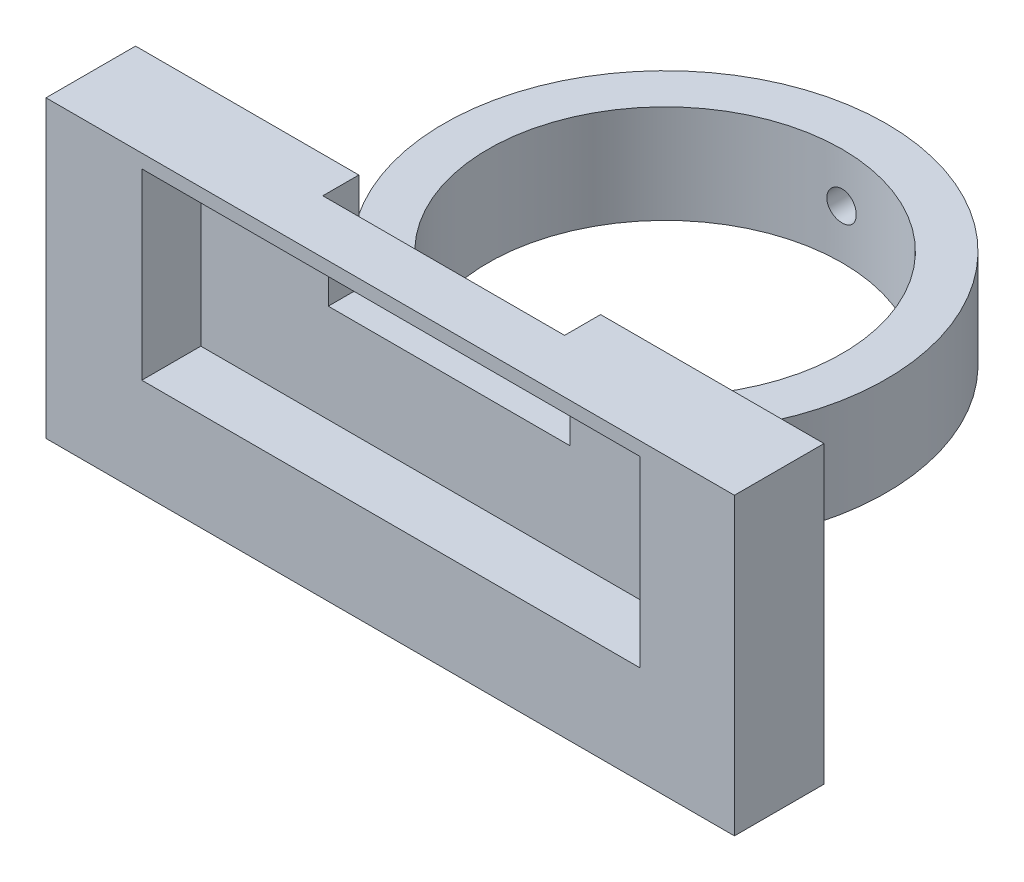
ISO-10303-21;
HEADER;
FILE_DESCRIPTION(('STEP AP214'),'2;1');
FILE_NAME('part.step','',(''),(''),'','','');
FILE_SCHEMA(('AUTOMOTIVE_DESIGN { 1 0 10303 214 1 1 1 1 }'));
ENDSEC;
DATA;
#1=APPLICATION_CONTEXT('core data for automotive mechanical design processes');
#2=APPLICATION_PROTOCOL_DEFINITION('international standard','automotive_design',2000,#1);
#3=PRODUCT_CONTEXT('',#1,'mechanical');
#4=PRODUCT('Part','Part','',(#3));
#5=PRODUCT_RELATED_PRODUCT_CATEGORY('part','',(#4));
#6=PRODUCT_DEFINITION_FORMATION('','',#4);
#7=PRODUCT_DEFINITION_CONTEXT('part definition',#1,'design');
#8=PRODUCT_DEFINITION('design','',#6,#7);
#9=PRODUCT_DEFINITION_SHAPE('','',#8);
#10=(LENGTH_UNIT() NAMED_UNIT(*) SI_UNIT(.MILLI.,.METRE.));
#11=(NAMED_UNIT(*) PLANE_ANGLE_UNIT() SI_UNIT($,.RADIAN.));
#12=(NAMED_UNIT(*) SI_UNIT($,.STERADIAN.) SOLID_ANGLE_UNIT());
#13=UNCERTAINTY_MEASURE_WITH_UNIT(LENGTH_MEASURE(1.E-05),#10,'distance_accuracy_value','');
#14=(GEOMETRIC_REPRESENTATION_CONTEXT(3) GLOBAL_UNCERTAINTY_ASSIGNED_CONTEXT((#13)) GLOBAL_UNIT_ASSIGNED_CONTEXT((#10,
#11,#12)) REPRESENTATION_CONTEXT('',''));
#15=CARTESIAN_POINT('',(0.,0.,0.));
#16=DIRECTION('',(0.,0.,1.));
#17=DIRECTION('',(1.,0.,0.));
#18=AXIS2_PLACEMENT_3D('',#15,#16,#17);
#19=CARTESIAN_POINT('',(-25.2569744084497,0.,27.9510252377639));
#20=DIRECTION('',(-1.,0.,0.));
#21=DIRECTION('',(0.,0.,1.));
#22=AXIS2_PLACEMENT_3D('',#19,#20,#21);
#23=PLANE('',#22);
#24=DIRECTION('',(0.,0.,-1.));
#25=VECTOR('',#24,1.);
#26=CARTESIAN_POINT('',(-25.2569744084497,18.613856740096,27.9510252377639));
#27=LINE('',#26,#25);
#28=CARTESIAN_POINT('',(-25.2569744084497,18.613856740096,27.9510252377639));
#29=VERTEX_POINT('',#28);
#30=CARTESIAN_POINT('',(-25.2569744084497,18.613856740096,21.9510252377639));
#31=VERTEX_POINT('',#30);
#32=EDGE_CURVE('E68',#29,#31,#27,.T.);
#33=ORIENTED_EDGE('',*,*,#32,.F.);
#34=DIRECTION('',(0.,1.,0.));
#35=VECTOR('',#34,1.);
#36=CARTESIAN_POINT('',(-25.2569744084497,0.,27.9510252377639));
#37=LINE('',#36,#35);
#38=CARTESIAN_POINT('',(-25.2569744084497,0.,27.9510252377639));
#39=VERTEX_POINT('',#38);
#40=EDGE_CURVE('E263',#39,#29,#37,.T.);
#41=ORIENTED_EDGE('',*,*,#40,.F.);
#42=DIRECTION('',(0.,0.,1.));
#43=VECTOR('',#42,1.);
#44=CARTESIAN_POINT('',(-25.2569744084497,0.,27.9510252377639));
#45=LINE('',#44,#43);
#46=CARTESIAN_POINT('',(-25.2569744084497,0.,21.9510252377639));
#47=VERTEX_POINT('',#46);
#48=EDGE_CURVE('E242',#47,#39,#45,.T.);
#49=ORIENTED_EDGE('',*,*,#48,.F.);
#50=DIRECTION('',(0.,1.,0.));
#51=VECTOR('',#50,1.);
#52=CARTESIAN_POINT('',(-25.2569744084497,0.,21.9510252377639));
#53=LINE('',#52,#51);
#54=EDGE_CURVE('E264',#47,#31,#53,.T.);
#55=ORIENTED_EDGE('',*,*,#54,.T.);
#56=EDGE_LOOP('',(#33,#41,#49,#55));
#57=FACE_BOUND('',#56,.T.);
#58=ADVANCED_FACE('F43',(#57),#23,.F.);
#59=CARTESIAN_POINT('',(-25.2569744084497,0.,21.9510252377639));
#60=DIRECTION('',(0.,0.,-1.));
#61=DIRECTION('',(-1.,0.,0.));
#62=AXIS2_PLACEMENT_3D('',#59,#60,#61);
#63=PLANE('',#62);
#64=DIRECTION('',(0.,1.,0.));
#65=VECTOR('',#64,1.);
#66=CARTESIAN_POINT('',(-12.2980825177343,0.,21.9510252377639));
#67=LINE('',#66,#65);
#68=CARTESIAN_POINT('',(-12.2980825177343,10.,21.9510252377639));
#69=VERTEX_POINT('',#68);
#70=CARTESIAN_POINT('',(-12.2980825177343,18.613856740096,21.9510252377639));
#71=VERTEX_POINT('',#70);
#72=EDGE_CURVE('E446',#69,#71,#67,.T.);
#73=ORIENTED_EDGE('',*,*,#72,.T.);
#74=DIRECTION('',(1.,0.,0.));
#75=VECTOR('',#74,1.);
#76=CARTESIAN_POINT('',(-30.6266619174264,18.613856740096,21.9510252377639));
#77=LINE('',#76,#75);
#78=EDGE_CURVE('E218',#31,#71,#77,.T.);
#79=ORIENTED_EDGE('',*,*,#78,.F.);
#80=ORIENTED_EDGE('',*,*,#54,.F.);
#81=DIRECTION('',(-1.,0.,0.));
#82=VECTOR('',#81,1.);
#83=CARTESIAN_POINT('',(-25.2569744084497,0.,21.9510252377639));
#84=LINE('',#83,#82);
#85=CARTESIAN_POINT('',(25.3733380825736,0.,21.9510252377639));
#86=VERTEX_POINT('',#85);
#87=EDGE_CURVE('E259',#86,#47,#84,.T.);
#88=ORIENTED_EDGE('',*,*,#87,.F.);
#89=DIRECTION('',(0.,1.,0.));
#90=VECTOR('',#89,1.);
#91=CARTESIAN_POINT('',(25.3733380825736,0.,21.9510252377639));
#92=LINE('',#91,#90);
#93=CARTESIAN_POINT('',(25.3733380825736,18.613856740096,21.9510252377639));
#94=VERTEX_POINT('',#93);
#95=EDGE_CURVE('E268',#86,#94,#92,.T.);
#96=ORIENTED_EDGE('',*,*,#95,.T.);
#97=CARTESIAN_POINT('',(12.2856792543905,18.613856740096,21.9510252377639));
#98=VERTEX_POINT('',#97);
#99=EDGE_CURVE('E217',#98,#94,#77,.T.);
#100=ORIENTED_EDGE('',*,*,#99,.F.);
#101=DIRECTION('',(0.,-1.,0.));
#102=VECTOR('',#101,1.);
#103=CARTESIAN_POINT('',(12.2856792543905,0.,21.9510252377639));
#104=LINE('',#103,#102);
#105=CARTESIAN_POINT('',(12.2856792543905,18.2212870740273,21.9510252377639));
#106=VERTEX_POINT('',#105);
#107=EDGE_CURVE('E199',#98,#106,#104,.T.);
#108=ORIENTED_EDGE('',*,*,#107,.T.);
#109=DIRECTION('',(1.,0.,0.));
#110=VECTOR('',#109,1.);
#111=CARTESIAN_POINT('',(-25.2569744084497,18.2212870740273,21.9510252377639));
#112=LINE('',#111,#110);
#113=CARTESIAN_POINT('',(12.293576837323,18.2212870740273,21.9510252377639));
#114=VERTEX_POINT('',#113);
#115=EDGE_CURVE('E448',#106,#114,#112,.T.);
#116=ORIENTED_EDGE('',*,*,#115,.T.);
#117=DIRECTION('',(0.,-1.,0.));
#118=VECTOR('',#117,1.);
#119=CARTESIAN_POINT('',(12.293576837323,0.,21.9510252377639));
#120=LINE('',#119,#118);
#121=CARTESIAN_POINT('',(12.293576837323,10.,21.9510252377639));
#122=VERTEX_POINT('',#121);
#123=EDGE_CURVE('E450',#114,#122,#120,.T.);
#124=ORIENTED_EDGE('',*,*,#123,.T.);
#125=DIRECTION('',(-1.,0.,0.));
#126=VECTOR('',#125,1.);
#127=CARTESIAN_POINT('',(-25.2569744084497,10.,21.9510252377639));
#128=LINE('',#127,#126);
#129=EDGE_CURVE('E308',#122,#69,#128,.T.);
#130=ORIENTED_EDGE('',*,*,#129,.T.);
#131=EDGE_LOOP('',(#73,#79,#80,#88,#96,#100,#108,#116,#124,#130));
#132=FACE_BOUND('',#131,.T.);
#133=ADVANCED_FACE('F333',(#132),#63,.F.);
#134=CARTESIAN_POINT('',(25.3733380825736,0.,27.9510252377639));
#135=DIRECTION('',(1.,0.,0.));
#136=DIRECTION('',(0.,0.,-1.));
#137=AXIS2_PLACEMENT_3D('',#134,#135,#136);
#138=PLANE('',#137);
#139=DIRECTION('',(0.,0.,1.));
#140=VECTOR('',#139,1.);
#141=CARTESIAN_POINT('',(25.3733380825736,18.613856740096,21.951025237764));
#142=LINE('',#141,#140);
#143=CARTESIAN_POINT('',(25.3733380825736,18.613856740096,27.9510252377639));
#144=VERTEX_POINT('',#143);
#145=EDGE_CURVE('E209',#94,#144,#142,.T.);
#146=ORIENTED_EDGE('',*,*,#145,.F.);
#147=ORIENTED_EDGE('',*,*,#95,.F.);
#148=DIRECTION('',(0.,0.,-1.));
#149=VECTOR('',#148,1.);
#150=CARTESIAN_POINT('',(25.3733380825736,0.,27.9510252377639));
#151=LINE('',#150,#149);
#152=CARTESIAN_POINT('',(25.3733380825736,0.,27.9510252377639));
#153=VERTEX_POINT('',#152);
#154=EDGE_CURVE('E255',#153,#86,#151,.T.);
#155=ORIENTED_EDGE('',*,*,#154,.F.);
#156=DIRECTION('',(0.,1.,0.));
#157=VECTOR('',#156,1.);
#158=CARTESIAN_POINT('',(25.3733380825736,0.,27.9510252377639));
#159=LINE('',#158,#157);
#160=EDGE_CURVE('E272',#153,#144,#159,.T.);
#161=ORIENTED_EDGE('',*,*,#160,.T.);
#162=EDGE_LOOP('',(#146,#147,#155,#161));
#163=FACE_BOUND('',#162,.T.);
#164=ADVANCED_FACE('F322',(#163),#138,.F.);
#165=CARTESIAN_POINT('',(0.,10.,0.));
#166=DIRECTION('',(0.,1.,0.));
#167=DIRECTION('',(0.,0.,1.));
#168=AXIS2_PLACEMENT_3D('',#165,#166,#167);
#169=PLANE('',#168);
#170=CARTESIAN_POINT('',(0.,10.,0.));
#171=DIRECTION('',(0.,1.,0.));
#172=DIRECTION('',(0.,0.,1.));
#173=AXIS2_PLACEMENT_3D('',#170,#171,#172);
#174=CIRCLE('',#173,22.5);
#175=CARTESIAN_POINT('',(12.293576837323,10.,18.8445739815162));
#176=VERTEX_POINT('',#175);
#177=CARTESIAN_POINT('',(-12.293576837323,10.,18.8445739815162));
#178=VERTEX_POINT('',#177);
#179=EDGE_CURVE('E434',#176,#178,#174,.T.);
#180=ORIENTED_EDGE('',*,*,#179,.T.);
#181=DIRECTION('',(-1.,0.,0.));
#182=VECTOR('',#181,1.);
#183=CARTESIAN_POINT('',(12.293576837323,10.,18.8445739815162));
#184=LINE('',#183,#182);
#185=CARTESIAN_POINT('',(-12.2980825177343,10.,18.8445739815162));
#186=VERTEX_POINT('',#185);
#187=EDGE_CURVE('E228',#178,#186,#184,.T.);
#188=ORIENTED_EDGE('',*,*,#187,.T.);
#189=DIRECTION('',(0.,0.,-1.));
#190=VECTOR('',#189,1.);
#191=CARTESIAN_POINT('',(-12.2980825177343,10.,34.8445739815162));
#192=LINE('',#191,#190);
#193=EDGE_CURVE('E243',#69,#186,#192,.T.);
#194=ORIENTED_EDGE('',*,*,#193,.F.);
#195=ORIENTED_EDGE('',*,*,#129,.F.);
#196=DIRECTION('',(0.,0.,-1.));
#197=VECTOR('',#196,1.);
#198=CARTESIAN_POINT('',(12.293576837323,10.,34.8445739815162));
#199=LINE('',#198,#197);
#200=EDGE_CURVE('E237',#122,#176,#199,.T.);
#201=ORIENTED_EDGE('',*,*,#200,.T.);
#202=EDGE_LOOP('',(#180,#188,#194,#195,#201));
#203=FACE_BOUND('',#202,.T.);
#204=CARTESIAN_POINT('',(0.,10.,0.));
#205=DIRECTION('',(0.,1.,0.));
#206=DIRECTION('',(0.,0.,1.));
#207=AXIS2_PLACEMENT_3D('',#204,#205,#206);
#208=CIRCLE('',#207,18.);
#209=CARTESIAN_POINT('',(0.,10.,18.));
#210=VERTEX_POINT('',#209);
#211=EDGE_CURVE('E426',#210,#210,#208,.T.);
#212=ORIENTED_EDGE('',*,*,#211,.F.);
#213=EDGE_LOOP('',(#212));
#214=FACE_BOUND('',#213,.T.);
#215=ADVANCED_FACE('F319',(#203,#214),#169,.T.);
#216=CARTESIAN_POINT('',(0.,0.,0.));
#217=DIRECTION('',(0.,1.,0.));
#218=DIRECTION('',(0.,0.,1.));
#219=AXIS2_PLACEMENT_3D('',#216,#217,#218);
#220=PLANE('',#219);
#221=CARTESIAN_POINT('',(0.,0.,0.));
#222=DIRECTION('',(0.,1.,0.));
#223=DIRECTION('',(0.,0.,1.));
#224=AXIS2_PLACEMENT_3D('',#221,#222,#223);
#225=CIRCLE('',#224,22.5);
#226=CARTESIAN_POINT('',(12.293576837323,0.,18.8445739815162));
#227=VERTEX_POINT('',#226);
#228=CARTESIAN_POINT('',(-12.293576837323,0.,18.8445739815162));
#229=VERTEX_POINT('',#228);
#230=EDGE_CURVE('E430',#227,#229,#225,.T.);
#231=ORIENTED_EDGE('',*,*,#230,.F.);
#232=DIRECTION('',(-1.,0.,0.));
#233=VECTOR('',#232,1.);
#234=CARTESIAN_POINT('',(0.,0.,18.8445739815162));
#235=LINE('',#234,#233);
#236=EDGE_CURVE('E418',#227,#229,#235,.T.);
#237=ORIENTED_EDGE('',*,*,#236,.T.);
#238=EDGE_LOOP('',(#231,#237));
#239=FACE_BOUND('',#238,.T.);
#240=CARTESIAN_POINT('',(0.,0.,0.));
#241=DIRECTION('',(0.,1.,0.));
#242=DIRECTION('',(0.,0.,1.));
#243=AXIS2_PLACEMENT_3D('',#240,#241,#242);
#244=CIRCLE('',#243,18.);
#245=CARTESIAN_POINT('',(0.,0.,18.));
#246=VERTEX_POINT('',#245);
#247=EDGE_CURVE('E422',#246,#246,#244,.T.);
#248=ORIENTED_EDGE('',*,*,#247,.T.);
#249=EDGE_LOOP('',(#248));
#250=FACE_BOUND('',#249,.T.);
#251=ADVANCED_FACE('F321',(#239,#250),#220,.F.);
#252=CARTESIAN_POINT('',(0.,10.,0.));
#253=DIRECTION('',(0.,-1.,0.));
#254=DIRECTION('',(0.,0.,-1.));
#255=AXIS2_PLACEMENT_3D('',#252,#253,#254);
#256=CYLINDRICAL_SURFACE('',#255,22.5);
#257=CARTESIAN_POINT('',(0.,3.5,-22.5));
#258=CARTESIAN_POINT('',(0.0841553862061873,3.50000369832235,-22.4999993369769));
#259=CARTESIAN_POINT('',(0.168369408071617,3.50710593144399,-22.4995228116078));
#260=CARTESIAN_POINT('',(0.334471280191391,3.53533573960185,-22.497667670565));
#261=CARTESIAN_POINT('',(0.41635632102312,3.55647956195042,-22.4962880099136));
#262=CARTESIAN_POINT('',(0.575370251039544,3.61218181268163,-22.4927826451578));
#263=CARTESIAN_POINT('',(0.652501656048259,3.64673307339375,-22.4906573397362));
#264=CARTESIAN_POINT('',(0.799850197924485,3.72825757575682,-22.4858995992832));
#265=CARTESIAN_POINT('',(0.870068894772799,3.77522800593263,-22.4832672790674));
#266=CARTESIAN_POINT('',(1.00173689918826,3.88034390087404,-22.4777863462909));
#267=CARTESIAN_POINT('',(1.06317301001788,3.93850588076531,-22.4749374178917));
#268=CARTESIAN_POINT('',(1.17541895156628,4.06431960769198,-22.4693470467491));
#269=CARTESIAN_POINT('',(1.22622833433915,4.13197175456335,-22.4666056085405));
#270=CARTESIAN_POINT('',(1.31582019049005,4.27492143699416,-22.4615369005082));
#271=CARTESIAN_POINT('',(1.35459154398957,4.35022595656899,-22.4592100144587));
#272=CARTESIAN_POINT('',(1.4189356460874,4.50629386174517,-22.4552369590289));
#273=CARTESIAN_POINT('',(1.44450855269208,4.58705718198292,-22.4535907814995));
#274=CARTESIAN_POINT('',(1.48169279908933,4.75162166691468,-22.4511678264529));
#275=CARTESIAN_POINT('',(1.49332502464134,4.83541809290052,-22.4503897484806));
#276=CARTESIAN_POINT('',(1.50236219626205,5.00377744658921,-22.4497868445664));
#277=CARTESIAN_POINT('',(1.49976732218638,5.08834036458875,-22.4499620065739));
#278=CARTESIAN_POINT('',(1.48044127015912,5.25568981402293,-22.4512446225728));
#279=CARTESIAN_POINT('',(1.46373271011688,5.33847897046898,-22.4523505848985));
#280=CARTESIAN_POINT('',(1.41668867338703,5.50007493564271,-22.4553678236737));
#281=CARTESIAN_POINT('',(1.38635310588313,5.57888171782623,-22.4572791054904));
#282=CARTESIAN_POINT('',(1.31289055516614,5.7303484616906,-22.4616933187345));
#283=CARTESIAN_POINT('',(1.26975333176157,5.80300344244616,-22.4641967234813));
#284=CARTESIAN_POINT('',(1.17191938938483,5.94004971876683,-22.4695126084811));
#285=CARTESIAN_POINT('',(1.11722252197117,6.0044409081966,-22.4723250927028));
#286=CARTESIAN_POINT('',(0.997694641249183,6.12326335209135,-22.4779488260716));
#287=CARTESIAN_POINT('',(0.932844057297467,6.17767492229296,-22.4807600620948));
#288=CARTESIAN_POINT('',(0.794918162485277,6.27484168557975,-22.4860592351969));
#289=CARTESIAN_POINT('',(0.721842848365169,6.31759687404525,-22.4885471721478));
#290=CARTESIAN_POINT('',(0.569529742100743,6.39023562310141,-22.492919642884));
#291=CARTESIAN_POINT('',(0.490291582636195,6.42011841577157,-22.4948041406687));
#292=CARTESIAN_POINT('',(0.327907494120451,6.46615084935259,-22.497756914152));
#293=CARTESIAN_POINT('',(0.244761616997557,6.48230067270169,-22.4988252006937));
#294=CARTESIAN_POINT('',(0.077093056686902,6.50038429138487,-22.5000237801539));
#295=CARTESIAN_POINT('',(-0.00742667947026603,6.50234529737109,-22.5001558684598));
#296=CARTESIAN_POINT('',(-0.175593857513399,6.4920667455921,-22.4994719464797));
#297=CARTESIAN_POINT('',(-0.259241304570734,6.47982727206283,-22.4986559418176));
#298=CARTESIAN_POINT('',(-0.423212640794056,6.44151772946781,-22.4961688340459));
#299=CARTESIAN_POINT('',(-0.503539464763436,6.41546016743359,-22.4944985042516));
#300=CARTESIAN_POINT('',(-0.658680012021291,6.35026684147132,-22.4904906131137));
#301=CARTESIAN_POINT('',(-0.733493678959281,6.31113094389102,-22.4881530449513));
#302=CARTESIAN_POINT('',(-0.875608697074926,6.22082276020867,-22.4830687483039));
#303=CARTESIAN_POINT('',(-0.942898494020247,6.16963232670972,-22.4803214052355));
#304=CARTESIAN_POINT('',(-1.06793929146973,6.05669455864405,-22.4747287160257));
#305=CARTESIAN_POINT('',(-1.12569018543068,5.99494710617811,-22.4718833687901));
#306=CARTESIAN_POINT('',(-1.23010622322674,5.8625305648099,-22.4664101381297));
#307=CARTESIAN_POINT('',(-1.27675369553493,5.79184752467411,-22.4637826056395));
#308=CARTESIAN_POINT('',(-1.35751781116107,5.6436362366452,-22.4590469316588));
#309=CARTESIAN_POINT('',(-1.39163454035583,5.56610803566846,-22.4569387866089));
#310=CARTESIAN_POINT('',(-1.44633820759184,5.40647136305112,-22.4534821719349));
#311=CARTESIAN_POINT('',(-1.46693621387226,5.32436669822714,-22.4521330809768));
#312=CARTESIAN_POINT('',(-1.49405386230003,5.15785500266751,-22.4503449996448));
#313=CARTESIAN_POINT('',(-1.5005736671706,5.07344799855492,-22.4499059987518));
#314=CARTESIAN_POINT('',(-1.49934822530218,4.90490331554578,-22.4499878612593));
#315=CARTESIAN_POINT('',(-1.49163075695864,4.82076543236533,-22.4505068555132));
#316=CARTESIAN_POINT('',(-1.46220749139271,4.65498309879855,-22.4524422638095));
#317=CARTESIAN_POINT('',(-1.44050166942031,4.57333865282421,-22.4538586794398));
#318=CARTESIAN_POINT('',(-1.38372425667426,4.41485705860405,-22.4574288540805));
#319=CARTESIAN_POINT('',(-1.34865285700377,4.33801984164201,-22.4595826025483));
#320=CARTESIAN_POINT('',(-1.26614347106291,4.19132038712225,-22.4643847219733));
#321=CARTESIAN_POINT('',(-1.21870578261043,4.12145798164587,-22.4670330810183));
#322=CARTESIAN_POINT('',(-1.11270716241545,3.99055004150066,-22.4725320443832));
#323=CARTESIAN_POINT('',(-1.0541260118745,3.92952089400215,-22.475383010332));
#324=CARTESIAN_POINT('',(-0.927533139832063,3.81814098609918,-22.4809627820297));
#325=CARTESIAN_POINT('',(-0.859519119169958,3.76779283666436,-22.4836915577811));
#326=CARTESIAN_POINT('',(-0.715904398258339,3.67916177368124,-22.4887226618343));
#327=CARTESIAN_POINT('',(-0.64029361195577,3.64089518720922,-22.4910244113345));
#328=CARTESIAN_POINT('',(-0.483759323129031,3.57764745615254,-22.4949345654383));
#329=CARTESIAN_POINT('',(-0.402842147075172,3.55265080294463,-22.4965437789929));
#330=CARTESIAN_POINT('',(-0.26786081065817,3.5231262656177,-22.4984673566654));
#331=CARTESIAN_POINT('',(-0.214668426242967,3.51446518502375,-22.499039532685));
#332=CARTESIAN_POINT('',(-0.107658694229485,3.50290087374109,-22.4998060661471));
#333=CARTESIAN_POINT('',(-0.0538413476281087,3.4999976338691,-22.5000004241922));
#334=CARTESIAN_POINT('',(0.,3.5,-22.5));
#335=B_SPLINE_CURVE_WITH_KNOTS('',3,(#257,#258,#259,#260,#261,#262,#263,#264,#265,#266,#267,
#268,#269,#270,#271,#272,#273,#274,#275,#276,#277,#278,#279,#280,#281,#282,#283,#284,#285,#286,
#287,#288,#289,#290,#291,#292,#293,#294,#295,#296,#297,#298,#299,#300,#301,#302,#303,#304,#305,
#306,#307,#308,#309,#310,#311,#312,#313,#314,#315,#316,#317,#318,#319,#320,#321,#322,#323,#324,
#325,#326,#327,#328,#329,#330,#331,#332,#333,#334),.UNSPECIFIED.,.T.,.F.,(4,2,2,2,2,2,2,2,2,2,2,
2,2,2,2,2,2,2,2,2,2,2,2,2,2,2,2,2,2,2,2,2,2,2,2,2,2,2,4),(0.,0.252269601066437,
0.504831609276693,0.757258782424872,1.00962885948595,1.26237424993085,1.51513029214491,
1.76811912259748,2.02110492430171,2.27371123002587,2.52631434236839,2.7785134115222,
3.03071416146472,3.28311719596362,3.53552347185635,3.78842237361861,4.04132137561042,
4.29423546255211,4.54714618955611,4.79957176729445,5.05199584767475,5.30419184290475,
5.55639041549575,5.80897111323598,6.06155463194424,6.31453749873668,6.56751863173209,
6.82029238121014,7.07306320898149,7.32534137618489,7.577619989753,7.82989499633663,
8.0821639279311,8.33489502146674,8.58768782410228,8.84082080405423,9.09365729155731,
9.25505583730029,9.41645412562546),.UNSPECIFIED.);
#336=CARTESIAN_POINT('',(0.,3.5,-22.5));
#337=VERTEX_POINT('',#336);
#338=EDGE_CURVE('E277',#337,#337,#335,.T.);
#339=ORIENTED_EDGE('',*,*,#338,.T.);
#340=EDGE_LOOP('',(#339));
#341=FACE_BOUND('',#340,.T.);
#342=ORIENTED_EDGE('',*,*,#179,.F.);
#343=DIRECTION('',(0.,-1.,0.));
#344=VECTOR('',#343,1.);
#345=CARTESIAN_POINT('',(12.293576837323,10.,18.8445739815162));
#346=LINE('',#345,#344);
#347=EDGE_CURVE('E306',#176,#227,#346,.T.);
#348=ORIENTED_EDGE('',*,*,#347,.T.);
#349=ORIENTED_EDGE('',*,*,#230,.T.);
#350=DIRECTION('',(0.,-1.,0.));
#351=VECTOR('',#350,1.);
#352=CARTESIAN_POINT('',(-12.293576837323,10.,18.8445739815162));
#353=LINE('',#352,#351);
#354=EDGE_CURVE('E438',#229,#178,#353,.F.);
#355=ORIENTED_EDGE('',*,*,#354,.T.);
#356=EDGE_LOOP('',(#342,#348,#349,#355));
#357=FACE_BOUND('',#356,.T.);
#358=ADVANCED_FACE('F45',(#341,#357),#256,.T.);
#359=CARTESIAN_POINT('',(0.,10.,0.));
#360=DIRECTION('',(0.,-1.,0.));
#361=DIRECTION('',(0.,0.,-1.));
#362=AXIS2_PLACEMENT_3D('',#359,#360,#361);
#363=CYLINDRICAL_SURFACE('',#362,18.);
#364=CARTESIAN_POINT('',(0.,6.5,-18.));
#365=CARTESIAN_POINT('',(-0.0840991348818063,6.49999632676058,-17.9999991811727));
#366=CARTESIAN_POINT('',(-0.168255520770338,6.49290354528343,-17.9994043281509));
#367=CARTESIAN_POINT('',(-0.334239856050584,6.46471347221738,-17.9970885349237));
#368=CARTESIAN_POINT('',(-0.416065057837845,6.44360031454265,-17.9953663189754));
#369=CARTESIAN_POINT('',(-0.574959033771391,6.38798426928595,-17.9909904186916));
#370=CARTESIAN_POINT('',(-0.652030470636923,6.35348895783527,-17.9883372614773));
#371=CARTESIAN_POINT('',(-0.799270850124113,6.27210135219201,-17.9823970161707));
#372=CARTESIAN_POINT('',(-0.869441264828082,6.22521170978374,-17.9791100637204));
#373=CARTESIAN_POINT('',(-1.00108499994839,6.12023740009101,-17.9722616980007));
#374=CARTESIAN_POINT('',(-1.06253830862424,6.06212767409647,-17.9686996812986));
#375=CARTESIAN_POINT('',(-1.17483170030483,5.9364156562251,-17.9617077120475));
#376=CARTESIAN_POINT('',(-1.22567131705726,5.86881294754607,-17.9582777653056));
#377=CARTESIAN_POINT('',(-1.31536188358534,5.72591282435146,-17.9519317899186));
#378=CARTESIAN_POINT('',(-1.35419524942731,5.65060433689584,-17.9490165177014));
#379=CARTESIAN_POINT('',(-1.41865865066077,5.49450755666603,-17.9440368667241));
#380=CARTESIAN_POINT('',(-1.44428891926862,5.41371936071262,-17.9419724729345));
#381=CARTESIAN_POINT('',(-1.48156054472786,5.24915691217823,-17.9389333809948));
#382=CARTESIAN_POINT('',(-1.49323449808466,5.1653900900111,-17.9379561440433));
#383=CARTESIAN_POINT('',(-1.50236281202314,4.99708069408195,-17.9371939848221));
#384=CARTESIAN_POINT('',(-1.49981743946931,4.9125381349085,-17.9374090401759));
#385=CARTESIAN_POINT('',(-1.48060629632227,4.74530050173422,-17.9390048604246));
#386=CARTESIAN_POINT('',(-1.46397595205708,4.66260132638538,-17.9403827006678));
#387=CARTESIAN_POINT('',(-1.41712197807441,4.50117219891057,-17.9441442535405));
#388=CARTESIAN_POINT('',(-1.38689821559518,4.42244228555922,-17.946527975994));
#389=CARTESIAN_POINT('',(-1.31367568222805,4.27107364118285,-17.9520360706028));
#390=CARTESIAN_POINT('',(-1.27066101713579,4.19844263361874,-17.9551613632645));
#391=CARTESIAN_POINT('',(-1.17308916587002,4.06141799177029,-17.9617996029582));
#392=CARTESIAN_POINT('',(-1.11853174593381,3.99702452435418,-17.9653125578405));
#393=CARTESIAN_POINT('',(-0.999224373339545,3.87809687107765,-17.9723433061747));
#394=CARTESIAN_POINT('',(-0.934443794085863,3.82359340380612,-17.975861081626));
#395=CARTESIAN_POINT('',(-0.796635834557626,3.72623041491717,-17.9824948780475));
#396=CARTESIAN_POINT('',(-0.723608448773006,3.68337090107967,-17.9856108987493));
#397=CARTESIAN_POINT('',(-0.571359889901777,3.61051435599694,-17.9910906871446));
#398=CARTESIAN_POINT('',(-0.492138062713611,3.58051868528277,-17.9934543752616));
#399=CARTESIAN_POINT('',(-0.329758603529373,3.53426280132301,-17.997162261177));
#400=CARTESIAN_POINT('',(-0.246601053253283,3.51800230301711,-17.9985064801333));
#401=CARTESIAN_POINT('',(-0.0789769502463768,3.49971685393763,-18.0000212541458));
#402=CARTESIAN_POINT('',(0.00548494367279356,3.49764947283965,-18.00019530738));
#403=CARTESIAN_POINT('',(0.173554128754954,3.50769779094097,-17.9993594816805));
#404=CARTESIAN_POINT('',(0.257161427882119,3.51981335784419,-17.9983496137901));
#405=CARTESIAN_POINT('',(0.421027134337048,3.55784848791514,-17.9952617676198));
#406=CARTESIAN_POINT('',(0.501290137709582,3.58374838403872,-17.9931853112613));
#407=CARTESIAN_POINT('',(0.656331247623733,3.64859688167304,-17.9881975516853));
#408=CARTESIAN_POINT('',(0.731109267424698,3.68754568948775,-17.9852862352686));
#409=CARTESIAN_POINT('',(0.87325082745286,3.77749302382453,-17.9789463959045));
#410=CARTESIAN_POINT('',(0.940596525782203,3.82851965959224,-17.9755166732811));
#411=CARTESIAN_POINT('',(1.06578164226543,3.94113358557572,-17.9685293795955));
#412=CARTESIAN_POINT('',(1.12362089522157,4.0027210592739,-17.9649718063129));
#413=CARTESIAN_POINT('',(1.22829681818265,4.13489253829751,-17.9581194182373));
#414=CARTESIAN_POINT('',(1.27510579985046,4.2054985117961,-17.9548252781133));
#415=CARTESIAN_POINT('',(1.35620259425928,4.35359339429512,-17.9488822761648));
#416=CARTESIAN_POINT('',(1.39049053201494,4.43108223456491,-17.9462334078977));
#417=CARTESIAN_POINT('',(1.44552476616085,4.59064518580886,-17.9418846427341));
#418=CARTESIAN_POINT('',(1.46628801217393,4.6727134170715,-17.9401835584295));
#419=CARTESIAN_POINT('',(1.49373865486523,4.83918604981164,-17.9379189853628));
#420=CARTESIAN_POINT('',(1.5004263218524,4.92359040639439,-17.9373554747545));
#421=CARTESIAN_POINT('',(1.4995328443364,5.09206418903134,-17.9374301692529));
#422=CARTESIAN_POINT('',(1.49199520466609,5.17613385085466,-17.938064710396));
#423=CARTESIAN_POINT('',(1.46295579494254,5.34180880032628,-17.9404562262346));
#424=CARTESIAN_POINT('',(1.44145400359144,5.42341408421576,-17.9422132026419));
#425=CARTESIAN_POINT('',(1.38510766502559,5.58184664489993,-17.9466506569756));
#426=CARTESIAN_POINT('',(1.3502639010098,5.65867420184853,-17.9493310806928));
#427=CARTESIAN_POINT('',(1.26822758842088,5.8053962608605,-17.955313498126));
#428=CARTESIAN_POINT('',(1.22103523367184,5.87529087171999,-17.9586154820857));
#429=CARTESIAN_POINT('',(1.11547791318367,6.00638560851952,-17.9654809754802));
#430=CARTESIAN_POINT('',(1.05708074061219,6.06755976298602,-17.9690452200862));
#431=CARTESIAN_POINT('',(0.930829838388699,6.17926277780498,-17.9760269251452));
#432=CARTESIAN_POINT('',(0.862973823961638,6.22978905874402,-17.9794443498724));
#433=CARTESIAN_POINT('',(0.719600659544123,6.31882979062634,-17.9857535226341));
#434=CARTESIAN_POINT('',(0.644069484405808,6.35732170798449,-17.9886442803466));
#435=CARTESIAN_POINT('',(0.4876436279936,6.42102770457692,-17.9935627877445));
#436=CARTESIAN_POINT('',(0.406755233120477,6.44625704643216,-17.9955915289238));
#437=CARTESIAN_POINT('',(0.27115807214502,6.47629637375307,-17.9980366160078));
#438=CARTESIAN_POINT('',(0.217321341657707,6.48517341877623,-17.9987695331543));
#439=CARTESIAN_POINT('',(0.108997757251744,6.49702641451581,-17.9997514898795));
#440=CARTESIAN_POINT('',(0.0545109050595676,6.5000023808997,-18.0000005307429));
#441=CARTESIAN_POINT('',(0.,6.5,-18.));
#442=B_SPLINE_CURVE_WITH_KNOTS('',3,(#364,#365,#366,#367,#368,#369,#370,#371,#372,#373,#374,
#375,#376,#377,#378,#379,#380,#381,#382,#383,#384,#385,#386,#387,#388,#389,#390,#391,#392,#393,
#394,#395,#396,#397,#398,#399,#400,#401,#402,#403,#404,#405,#406,#407,#408,#409,#410,#411,#412,
#413,#414,#415,#416,#417,#418,#419,#420,#421,#422,#423,#424,#425,#426,#427,#428,#429,#430,#431,
#432,#433,#434,#435,#436,#437,#438,#439,#440,#441),.UNSPECIFIED.,.T.,.F.,(4,2,2,2,2,2,2,2,2,2,2,
2,2,2,2,2,2,2,2,2,2,2,2,2,2,2,2,2,2,2,2,2,2,2,2,2,2,2,4),(0.,0.252098380200208,
0.504482533496752,0.756724010833431,1.00891156437627,1.26166900317865,1.51443754310897,
1.76757454426637,2.02070707391851,2.27324722247379,2.52578263143928,2.77768474665434,
3.02958932215498,3.28180823623349,3.5340322587129,3.78702676402724,4.04002143837967,
4.29304286385675,4.54605903798802,4.79831848960753,5.05057558821332,5.30247373546178,
5.55437586542058,5.8068701246239,6.05936877106876,6.31249464736803,6.56561799629742,
6.81842350861392,7.07122416598136,7.32325294323791,7.5752821048851,7.82729647421284,
8.07930688814784,8.33205282996958,8.58485992848721,8.8381375959383,9.09112314887678,
9.25452729534993,9.41793100798119),.UNSPECIFIED.);
#443=CARTESIAN_POINT('',(0.,6.5,-18.));
#444=VERTEX_POINT('',#443);
#445=EDGE_CURVE('E267',#444,#444,#442,.T.);
#446=ORIENTED_EDGE('',*,*,#445,.F.);
#447=EDGE_LOOP('',(#446));
#448=FACE_BOUND('',#447,.T.);
#449=ORIENTED_EDGE('',*,*,#211,.T.);
#450=EDGE_LOOP('',(#449));
#451=FACE_BOUND('',#450,.T.);
#452=ORIENTED_EDGE('',*,*,#247,.F.);
#453=EDGE_LOOP('',(#452));
#454=FACE_BOUND('',#453,.T.);
#455=ADVANCED_FACE('F310',(#448,#451,#454),#363,.F.);
#456=CARTESIAN_POINT('',(-35.,-10.,18.8445739815162));
#457=DIRECTION('',(0.,0.,-1.));
#458=DIRECTION('',(-1.,0.,0.));
#459=AXIS2_PLACEMENT_3D('',#456,#457,#458);
#460=PLANE('',#459);
#461=DIRECTION('',(-1.,0.,0.));
#462=VECTOR('',#461,1.);
#463=CARTESIAN_POINT('',(-35.,20.,18.8445739815162));
#464=LINE('',#463,#462);
#465=CARTESIAN_POINT('',(-12.2980825177343,20.,18.8445739815162));
#466=VERTEX_POINT('',#465);
#467=CARTESIAN_POINT('',(-35.,20.,18.8445739815162));
#468=VERTEX_POINT('',#467);
#469=EDGE_CURVE('E383',#466,#468,#464,.T.);
#470=ORIENTED_EDGE('',*,*,#469,.F.);
#471=DIRECTION('',(0.,1.,0.));
#472=VECTOR('',#471,1.);
#473=CARTESIAN_POINT('',(-12.2980825177343,10.,18.8445739815162));
#474=LINE('',#473,#472);
#475=EDGE_CURVE('E183',#186,#466,#474,.T.);
#476=ORIENTED_EDGE('',*,*,#475,.F.);
#477=ORIENTED_EDGE('',*,*,#187,.F.);
#478=ORIENTED_EDGE('',*,*,#354,.F.);
#479=ORIENTED_EDGE('',*,*,#236,.F.);
#480=ORIENTED_EDGE('',*,*,#347,.F.);
#481=DIRECTION('',(0.,-1.,0.));
#482=VECTOR('',#481,1.);
#483=CARTESIAN_POINT('',(12.293576837323,10.,18.8445739815162));
#484=LINE('',#483,#482);
#485=CARTESIAN_POINT('',(12.293576837323,18.2212870740273,18.8445739815162));
#486=VERTEX_POINT('',#485);
#487=EDGE_CURVE('E224',#486,#176,#484,.T.);
#488=ORIENTED_EDGE('',*,*,#487,.F.);
#489=DIRECTION('',(1.,0.,0.));
#490=VECTOR('',#489,1.);
#491=CARTESIAN_POINT('',(12.293576837323,18.2212870740273,18.8445739815162));
#492=LINE('',#491,#490);
#493=CARTESIAN_POINT('',(12.2856792543905,18.2212870740273,18.8445739815162));
#494=VERTEX_POINT('',#493);
#495=EDGE_CURVE('E234',#494,#486,#492,.T.);
#496=ORIENTED_EDGE('',*,*,#495,.F.);
#497=DIRECTION('',(0.,1.,0.));
#498=VECTOR('',#497,1.);
#499=CARTESIAN_POINT('',(12.2856792543905,15.,18.8445739815162));
#500=LINE('',#499,#498);
#501=CARTESIAN_POINT('',(12.2856792543905,20.,18.8445739815162));
#502=VERTEX_POINT('',#501);
#503=EDGE_CURVE('E195',#494,#502,#500,.T.);
#504=ORIENTED_EDGE('',*,*,#503,.T.);
#505=CARTESIAN_POINT('',(35.,20.,18.8445739815162));
#506=VERTEX_POINT('',#505);
#507=EDGE_CURVE('E386',#506,#502,#464,.T.);
#508=ORIENTED_EDGE('',*,*,#507,.F.);
#509=DIRECTION('',(0.,1.,0.));
#510=VECTOR('',#509,1.);
#511=CARTESIAN_POINT('',(35.,-10.,18.8445739815162));
#512=LINE('',#511,#510);
#513=CARTESIAN_POINT('',(35.,-10.,18.8445739815162));
#514=VERTEX_POINT('',#513);
#515=EDGE_CURVE('E411',#514,#506,#512,.T.);
#516=ORIENTED_EDGE('',*,*,#515,.F.);
#517=DIRECTION('',(-1.,0.,0.));
#518=VECTOR('',#517,1.);
#519=CARTESIAN_POINT('',(-35.,-10.,18.8445739815162));
#520=LINE('',#519,#518);
#521=CARTESIAN_POINT('',(-35.,-10.,18.8445739815162));
#522=VERTEX_POINT('',#521);
#523=EDGE_CURVE('E400',#514,#522,#520,.T.);
#524=ORIENTED_EDGE('',*,*,#523,.T.);
#525=DIRECTION('',(0.,1.,0.));
#526=VECTOR('',#525,1.);
#527=CARTESIAN_POINT('',(-35.,-10.,18.8445739815162));
#528=LINE('',#527,#526);
#529=EDGE_CURVE('E414',#522,#468,#528,.T.);
#530=ORIENTED_EDGE('',*,*,#529,.T.);
#531=EDGE_LOOP('',(#470,#476,#477,#478,#479,#480,#488,#496,#504,#508,#516,#524,#530));
#532=FACE_BOUND('',#531,.T.);
#533=ADVANCED_FACE('F315',(#532),#460,.T.);
#534=CARTESIAN_POINT('',(-35.,-10.,18.8445739815162));
#535=DIRECTION('',(-1.,0.,0.));
#536=DIRECTION('',(0.,0.,1.));
#537=AXIS2_PLACEMENT_3D('',#534,#535,#536);
#538=PLANE('',#537);
#539=DIRECTION('',(0.,1.,0.));
#540=VECTOR('',#539,1.);
#541=CARTESIAN_POINT('',(-35.,-10.,27.9510252377639));
#542=LINE('',#541,#540);
#543=CARTESIAN_POINT('',(-35.,-10.,27.9510252377639));
#544=VERTEX_POINT('',#543);
#545=CARTESIAN_POINT('',(-35.,20.,27.9510252377639));
#546=VERTEX_POINT('',#545);
#547=EDGE_CURVE('E404',#544,#546,#542,.T.);
#548=ORIENTED_EDGE('',*,*,#547,.T.);
#549=DIRECTION('',(0.,0.,1.));
#550=VECTOR('',#549,1.);
#551=CARTESIAN_POINT('',(-35.,20.,18.8445739815162));
#552=LINE('',#551,#550);
#553=EDGE_CURVE('E285',#468,#546,#552,.T.);
#554=ORIENTED_EDGE('',*,*,#553,.F.);
#555=ORIENTED_EDGE('',*,*,#529,.F.);
#556=DIRECTION('',(0.,0.,1.));
#557=VECTOR('',#556,1.);
#558=CARTESIAN_POINT('',(-35.,-10.,18.8445739815162));
#559=LINE('',#558,#557);
#560=EDGE_CURVE('E389',#522,#544,#559,.T.);
#561=ORIENTED_EDGE('',*,*,#560,.T.);
#562=EDGE_LOOP('',(#548,#554,#555,#561));
#563=FACE_BOUND('',#562,.T.);
#564=ADVANCED_FACE('F317',(#563),#538,.T.);
#565=CARTESIAN_POINT('',(35.,-10.,18.8445739815162));
#566=DIRECTION('',(1.,0.,0.));
#567=DIRECTION('',(0.,0.,-1.));
#568=AXIS2_PLACEMENT_3D('',#565,#566,#567);
#569=PLANE('',#568);
#570=ORIENTED_EDGE('',*,*,#515,.T.);
#571=DIRECTION('',(0.,0.,-1.));
#572=VECTOR('',#571,1.);
#573=CARTESIAN_POINT('',(35.,20.,18.8445739815162));
#574=LINE('',#573,#572);
#575=CARTESIAN_POINT('',(35.,20.,27.9510252377639));
#576=VERTEX_POINT('',#575);
#577=EDGE_CURVE('E380',#576,#506,#574,.T.);
#578=ORIENTED_EDGE('',*,*,#577,.F.);
#579=DIRECTION('',(0.,1.,0.));
#580=VECTOR('',#579,1.);
#581=CARTESIAN_POINT('',(35.,-10.,27.9510252377639));
#582=LINE('',#581,#580);
#583=CARTESIAN_POINT('',(35.,-10.,27.9510252377639));
#584=VERTEX_POINT('',#583);
#585=EDGE_CURVE('E407',#584,#576,#582,.T.);
#586=ORIENTED_EDGE('',*,*,#585,.F.);
#587=DIRECTION('',(0.,0.,-1.));
#588=VECTOR('',#587,1.);
#589=CARTESIAN_POINT('',(35.,-10.,18.8445739815162));
#590=LINE('',#589,#588);
#591=EDGE_CURVE('E396',#584,#514,#590,.T.);
#592=ORIENTED_EDGE('',*,*,#591,.T.);
#593=EDGE_LOOP('',(#570,#578,#586,#592));
#594=FACE_BOUND('',#593,.T.);
#595=ADVANCED_FACE('F477',(#594),#569,.T.);
#596=CARTESIAN_POINT('',(-35.,-10.,27.9510252377639));
#597=DIRECTION('',(0.,0.,1.));
#598=DIRECTION('',(1.,0.,0.));
#599=AXIS2_PLACEMENT_3D('',#596,#597,#598);
#600=PLANE('',#599);
#601=ORIENTED_EDGE('',*,*,#40,.T.);
#602=DIRECTION('',(1.,0.,0.));
#603=VECTOR('',#602,1.);
#604=CARTESIAN_POINT('',(-30.6266619174265,18.613856740096,27.9510252377639));
#605=LINE('',#604,#603);
#606=EDGE_CURVE('E213',#29,#144,#605,.T.);
#607=ORIENTED_EDGE('',*,*,#606,.T.);
#608=ORIENTED_EDGE('',*,*,#160,.F.);
#609=DIRECTION('',(1.,0.,0.));
#610=VECTOR('',#609,1.);
#611=CARTESIAN_POINT('',(-25.2569744084497,0.,27.9510252377639));
#612=LINE('',#611,#610);
#613=EDGE_CURVE('E251',#39,#153,#612,.T.);
#614=ORIENTED_EDGE('',*,*,#613,.F.);
#615=EDGE_LOOP('',(#601,#607,#608,#614));
#616=FACE_BOUND('',#615,.T.);
#617=ORIENTED_EDGE('',*,*,#585,.T.);
#618=DIRECTION('',(1.,0.,0.));
#619=VECTOR('',#618,1.);
#620=CARTESIAN_POINT('',(-35.,20.,27.9510252377639));
#621=LINE('',#620,#619);
#622=EDGE_CURVE('E378',#546,#576,#621,.T.);
#623=ORIENTED_EDGE('',*,*,#622,.F.);
#624=ORIENTED_EDGE('',*,*,#547,.F.);
#625=DIRECTION('',(1.,0.,0.));
#626=VECTOR('',#625,1.);
#627=CARTESIAN_POINT('',(-35.,-10.,27.9510252377639));
#628=LINE('',#627,#626);
#629=EDGE_CURVE('E392',#544,#584,#628,.T.);
#630=ORIENTED_EDGE('',*,*,#629,.T.);
#631=EDGE_LOOP('',(#617,#623,#624,#630));
#632=FACE_BOUND('',#631,.T.);
#633=ADVANCED_FACE('F472',(#616,#632),#600,.T.);
#634=CARTESIAN_POINT('',(0.,-10.,0.));
#635=DIRECTION('',(0.,1.,0.));
#636=DIRECTION('',(0.,0.,1.));
#637=AXIS2_PLACEMENT_3D('',#634,#635,#636);
#638=PLANE('',#637);
#639=ORIENTED_EDGE('',*,*,#560,.F.);
#640=ORIENTED_EDGE('',*,*,#523,.F.);
#641=ORIENTED_EDGE('',*,*,#591,.F.);
#642=ORIENTED_EDGE('',*,*,#629,.F.);
#643=EDGE_LOOP('',(#639,#640,#641,#642));
#644=FACE_BOUND('',#643,.T.);
#645=ADVANCED_FACE('F476',(#644),#638,.F.);
#646=CARTESIAN_POINT('',(0.,20.,0.));
#647=DIRECTION('',(0.,1.,0.));
#648=DIRECTION('',(0.,0.,1.));
#649=AXIS2_PLACEMENT_3D('',#646,#647,#648);
#650=PLANE('',#649);
#651=DIRECTION('',(0.,0.,1.));
#652=VECTOR('',#651,1.);
#653=CARTESIAN_POINT('',(-12.2980825177343,20.,18.8445739815162));
#654=LINE('',#653,#652);
#655=CARTESIAN_POINT('',(-12.2980825177343,20.,22.5068189175204));
#656=VERTEX_POINT('',#655);
#657=EDGE_CURVE('E180',#466,#656,#654,.T.);
#658=ORIENTED_EDGE('',*,*,#657,.F.);
#659=ORIENTED_EDGE('',*,*,#469,.T.);
#660=ORIENTED_EDGE('',*,*,#553,.T.);
#661=ORIENTED_EDGE('',*,*,#622,.T.);
#662=ORIENTED_EDGE('',*,*,#577,.T.);
#663=ORIENTED_EDGE('',*,*,#507,.T.);
#664=DIRECTION('',(0.,0.,-1.));
#665=VECTOR('',#664,1.);
#666=CARTESIAN_POINT('',(12.2856792543905,20.,18.8445739815162));
#667=LINE('',#666,#665);
#668=CARTESIAN_POINT('',(12.2856792543905,20.,22.5068189175204));
#669=VERTEX_POINT('',#668);
#670=EDGE_CURVE('E177',#669,#502,#667,.T.);
#671=ORIENTED_EDGE('',*,*,#670,.F.);
#672=DIRECTION('',(1.,0.,0.));
#673=VECTOR('',#672,1.);
#674=CARTESIAN_POINT('',(-12.2980825177343,20.,22.5068189175204));
#675=LINE('',#674,#673);
#676=EDGE_CURVE('E170',#656,#669,#675,.T.);
#677=ORIENTED_EDGE('',*,*,#676,.F.);
#678=EDGE_LOOP('',(#658,#659,#660,#661,#662,#663,#671,#677));
#679=FACE_BOUND('',#678,.T.);
#680=ADVANCED_FACE('F188',(#679),#650,.T.);
#681=CARTESIAN_POINT('',(0.,5.,-22.5));
#682=DIRECTION('',(0.,0.,1.));
#683=DIRECTION('',(1.,0.,0.));
#684=AXIS2_PLACEMENT_3D('',#681,#682,#683);
#685=CYLINDRICAL_SURFACE('',#684,1.5);
#686=ORIENTED_EDGE('',*,*,#445,.T.);
#687=EDGE_LOOP('',(#686));
#688=FACE_BOUND('',#687,.T.);
#689=ORIENTED_EDGE('',*,*,#338,.F.);
#690=EDGE_LOOP('',(#689));
#691=FACE_BOUND('',#690,.T.);
#692=ADVANCED_FACE('F287',(#688,#691),#685,.F.);
#693=CARTESIAN_POINT('',(0.,0.,0.));
#694=DIRECTION('',(0.,-1.,0.));
#695=DIRECTION('',(0.,0.,-1.));
#696=AXIS2_PLACEMENT_3D('',#693,#694,#695);
#697=PLANE('',#696);
#698=ORIENTED_EDGE('',*,*,#48,.T.);
#699=ORIENTED_EDGE('',*,*,#613,.T.);
#700=ORIENTED_EDGE('',*,*,#154,.T.);
#701=ORIENTED_EDGE('',*,*,#87,.T.);
#702=EDGE_LOOP('',(#698,#699,#700,#701));
#703=FACE_BOUND('',#702,.T.);
#704=ADVANCED_FACE('F292',(#703),#697,.F.);
#705=CARTESIAN_POINT('',(12.293576837323,10.,34.8445739815162));
#706=DIRECTION('',(1.,0.,0.));
#707=DIRECTION('',(0.,0.,-1.));
#708=AXIS2_PLACEMENT_3D('',#705,#706,#707);
#709=PLANE('',#708);
#710=DIRECTION('',(0.,0.,-1.));
#711=VECTOR('',#710,1.);
#712=CARTESIAN_POINT('',(12.293576837323,18.2212870740273,34.8445739815162));
#713=LINE('',#712,#711);
#714=EDGE_CURVE('E238',#114,#486,#713,.T.);
#715=ORIENTED_EDGE('',*,*,#714,.T.);
#716=ORIENTED_EDGE('',*,*,#487,.T.);
#717=ORIENTED_EDGE('',*,*,#200,.F.);
#718=ORIENTED_EDGE('',*,*,#123,.F.);
#719=EDGE_LOOP('',(#715,#716,#717,#718));
#720=FACE_BOUND('',#719,.T.);
#721=ADVANCED_FACE('F346',(#720),#709,.F.);
#722=CARTESIAN_POINT('',(12.293576837323,18.2212870740273,34.8445739815162));
#723=DIRECTION('',(0.,1.,0.));
#724=DIRECTION('',(0.,0.,1.));
#725=AXIS2_PLACEMENT_3D('',#722,#723,#724);
#726=PLANE('',#725);
#727=ORIENTED_EDGE('',*,*,#115,.F.);
#728=DIRECTION('',(0.,0.,-1.));
#729=VECTOR('',#728,1.);
#730=CARTESIAN_POINT('',(12.2856792543905,18.2212870740273,34.8445739815162));
#731=LINE('',#730,#729);
#732=EDGE_CURVE('E205',#106,#494,#731,.T.);
#733=ORIENTED_EDGE('',*,*,#732,.T.);
#734=ORIENTED_EDGE('',*,*,#495,.T.);
#735=ORIENTED_EDGE('',*,*,#714,.F.);
#736=EDGE_LOOP('',(#727,#733,#734,#735));
#737=FACE_BOUND('',#736,.T.);
#738=ADVANCED_FACE('F350',(#737),#726,.F.);
#739=CARTESIAN_POINT('',(-12.2980825177343,10.,34.8445739815162));
#740=DIRECTION('',(-1.,0.,0.));
#741=DIRECTION('',(0.,0.,1.));
#742=AXIS2_PLACEMENT_3D('',#739,#740,#741);
#743=PLANE('',#742);
#744=DIRECTION('',(0.,0.,1.));
#745=VECTOR('',#744,1.);
#746=CARTESIAN_POINT('',(-12.2980825177343,18.613856740096,21.9510252377639));
#747=LINE('',#746,#745);
#748=CARTESIAN_POINT('',(-12.2980825177343,18.613856740096,22.5068189175204));
#749=VERTEX_POINT('',#748);
#750=EDGE_CURVE('E11',#71,#749,#747,.T.);
#751=ORIENTED_EDGE('',*,*,#750,.F.);
#752=ORIENTED_EDGE('',*,*,#72,.F.);
#753=ORIENTED_EDGE('',*,*,#193,.T.);
#754=ORIENTED_EDGE('',*,*,#475,.T.);
#755=ORIENTED_EDGE('',*,*,#657,.T.);
#756=DIRECTION('',(0.,1.,0.));
#757=VECTOR('',#756,1.);
#758=CARTESIAN_POINT('',(-12.2980825177343,15.,22.5068189175204));
#759=LINE('',#758,#757);
#760=EDGE_CURVE('E166',#749,#656,#759,.T.);
#761=ORIENTED_EDGE('',*,*,#760,.F.);
#762=EDGE_LOOP('',(#751,#752,#753,#754,#755,#761));
#763=FACE_BOUND('',#762,.T.);
#764=ADVANCED_FACE('F181',(#763),#743,.F.);
#765=CARTESIAN_POINT('',(-30.6266619174264,18.613856740096,21.9510252377639));
#766=DIRECTION('',(0.,1.,0.));
#767=DIRECTION('',(0.,0.,1.));
#768=AXIS2_PLACEMENT_3D('',#765,#766,#767);
#769=PLANE('',#768);
#770=ORIENTED_EDGE('',*,*,#78,.T.);
#771=ORIENTED_EDGE('',*,*,#750,.T.);
#772=DIRECTION('',(1.,0.,0.));
#773=VECTOR('',#772,1.);
#774=CARTESIAN_POINT('',(-30.6266619174264,18.613856740096,22.5068189175204));
#775=LINE('',#774,#773);
#776=CARTESIAN_POINT('',(12.2856792543905,18.613856740096,22.5068189175204));
#777=VERTEX_POINT('',#776);
#778=EDGE_CURVE('E173',#749,#777,#775,.T.);
#779=ORIENTED_EDGE('',*,*,#778,.T.);
#780=DIRECTION('',(0.,0.,-1.));
#781=VECTOR('',#780,1.);
#782=CARTESIAN_POINT('',(12.2856792543905,18.613856740096,21.9510252377639));
#783=LINE('',#782,#781);
#784=EDGE_CURVE('E53',#777,#98,#783,.T.);
#785=ORIENTED_EDGE('',*,*,#784,.T.);
#786=ORIENTED_EDGE('',*,*,#99,.T.);
#787=ORIENTED_EDGE('',*,*,#145,.T.);
#788=ORIENTED_EDGE('',*,*,#606,.F.);
#789=ORIENTED_EDGE('',*,*,#32,.T.);
#790=EDGE_LOOP('',(#770,#771,#779,#785,#786,#787,#788,#789));
#791=FACE_BOUND('',#790,.T.);
#792=ADVANCED_FACE('F354',(#791),#769,.F.);
#793=CARTESIAN_POINT('',(12.2856792543905,15.,18.8445739815162));
#794=DIRECTION('',(1.,0.,0.));
#795=DIRECTION('',(0.,0.,-1.));
#796=AXIS2_PLACEMENT_3D('',#793,#794,#795);
#797=PLANE('',#796);
#798=ORIENTED_EDGE('',*,*,#107,.F.);
#799=ORIENTED_EDGE('',*,*,#784,.F.);
#800=DIRECTION('',(0.,1.,0.));
#801=VECTOR('',#800,1.);
#802=CARTESIAN_POINT('',(12.2856792543905,15.,22.5068189175204));
#803=LINE('',#802,#801);
#804=EDGE_CURVE('E60',#777,#669,#803,.T.);
#805=ORIENTED_EDGE('',*,*,#804,.T.);
#806=ORIENTED_EDGE('',*,*,#670,.T.);
#807=ORIENTED_EDGE('',*,*,#503,.F.);
#808=ORIENTED_EDGE('',*,*,#732,.F.);
#809=EDGE_LOOP('',(#798,#799,#805,#806,#807,#808));
#810=FACE_BOUND('',#809,.T.);
#811=ADVANCED_FACE('F360',(#810),#797,.F.);
#812=CARTESIAN_POINT('',(-12.2980825177343,15.,22.5068189175204));
#813=DIRECTION('',(0.,0.,1.));
#814=DIRECTION('',(1.,0.,0.));
#815=AXIS2_PLACEMENT_3D('',#812,#813,#814);
#816=PLANE('',#815);
#817=ORIENTED_EDGE('',*,*,#760,.T.);
#818=ORIENTED_EDGE('',*,*,#676,.T.);
#819=ORIENTED_EDGE('',*,*,#804,.F.);
#820=ORIENTED_EDGE('',*,*,#778,.F.);
#821=EDGE_LOOP('',(#817,#818,#819,#820));
#822=FACE_BOUND('',#821,.T.);
#823=ADVANCED_FACE('F168',(#822),#816,.F.);
#824=CLOSED_SHELL('',(#58,#133,#164,#215,#251,#358,#455,#533,#564,#595,#633,#645,#680,#692,#704,
#721,#738,#764,#792,#811,#823));
#825=MANIFOLD_SOLID_BREP('B2',#824);
#826=ADVANCED_BREP_SHAPE_REPRESENTATION('',(#18,#825),#14);
#827=SHAPE_DEFINITION_REPRESENTATION(#9,#826);
ENDSEC;
END-ISO-10303-21;
